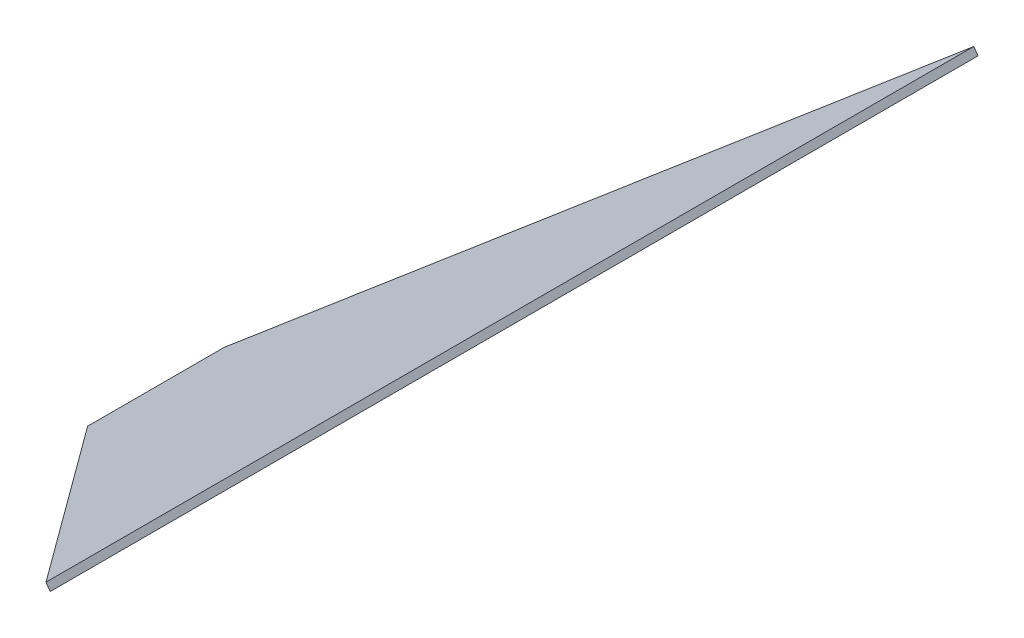
ISO-10303-21;
HEADER;
FILE_DESCRIPTION(('STEP AP214'),'2;1');
FILE_NAME('part.step','',(''),(''),'','','');
FILE_SCHEMA(('AUTOMOTIVE_DESIGN { 1 0 10303 214 1 1 1 1 }'));
ENDSEC;
DATA;
#1=APPLICATION_CONTEXT('core data for automotive mechanical design processes');
#2=APPLICATION_PROTOCOL_DEFINITION('international standard','automotive_design',2000,#1);
#3=PRODUCT_CONTEXT('',#1,'mechanical');
#4=PRODUCT('Part','Part','',(#3));
#5=PRODUCT_RELATED_PRODUCT_CATEGORY('part','',(#4));
#6=PRODUCT_DEFINITION_FORMATION('','',#4);
#7=PRODUCT_DEFINITION_CONTEXT('part definition',#1,'design');
#8=PRODUCT_DEFINITION('design','',#6,#7);
#9=PRODUCT_DEFINITION_SHAPE('','',#8);
#10=(LENGTH_UNIT() NAMED_UNIT(*) SI_UNIT(.MILLI.,.METRE.));
#11=(NAMED_UNIT(*) PLANE_ANGLE_UNIT() SI_UNIT($,.RADIAN.));
#12=(NAMED_UNIT(*) SI_UNIT($,.STERADIAN.) SOLID_ANGLE_UNIT());
#13=UNCERTAINTY_MEASURE_WITH_UNIT(LENGTH_MEASURE(1.E-05),#10,'distance_accuracy_value','');
#14=(GEOMETRIC_REPRESENTATION_CONTEXT(3) GLOBAL_UNCERTAINTY_ASSIGNED_CONTEXT((#13)) GLOBAL_UNIT_ASSIGNED_CONTEXT((#10,
#11,#12)) REPRESENTATION_CONTEXT('',''));
#15=CARTESIAN_POINT('',(0.,0.,0.));
#16=DIRECTION('',(0.,0.,1.));
#17=DIRECTION('',(1.,0.,0.));
#18=AXIS2_PLACEMENT_3D('',#15,#16,#17);
#19=CARTESIAN_POINT('',(50.0000000000007,38.099999999999,787.4));
#20=DIRECTION('',(0.827951759875369,0.560799325355586,0.));
#21=DIRECTION('',(-0.560799325355586,0.827951759875369,0.));
#22=AXIS2_PLACEMENT_3D('',#19,#20,#21);
#23=PLANE('',#22);
#24=DIRECTION('',(-0.560799325355585,0.827951759875369,0.));
#25=VECTOR('',#24,1.);
#26=CARTESIAN_POINT('',(144.348764995784,-101.194436509524,335.417163822782));
#27=LINE('',#26,#25);
#28=CARTESIAN_POINT('',(50.0000000000007,38.099999999999,335.417163822782));
#29=VERTEX_POINT('',#28);
#30=CARTESIAN_POINT('',(46.4950042165282,43.2746984992201,335.417163822782));
#31=VERTEX_POINT('',#30);
#32=EDGE_CURVE('E103',#29,#31,#27,.T.);
#33=ORIENTED_EDGE('',*,*,#32,.F.);
#34=DIRECTION('',(0.,0.,-1.));
#35=VECTOR('',#34,1.);
#36=CARTESIAN_POINT('',(50.0000000000007,38.099999999999,787.4));
#37=LINE('',#36,#35);
#38=CARTESIAN_POINT('',(50.0000000000007,38.099999999999,451.856561062794));
#39=VERTEX_POINT('',#38);
#40=EDGE_CURVE('E114',#39,#29,#37,.T.);
#41=ORIENTED_EDGE('',*,*,#40,.F.);
#42=DIRECTION('',(-0.560799325355585,0.827951759875369,0.));
#43=VECTOR('',#42,1.);
#44=CARTESIAN_POINT('',(144.348764995784,-101.194436509524,451.856561062794));
#45=LINE('',#44,#43);
#46=CARTESIAN_POINT('',(46.4950042165282,43.2746984992201,451.856561062794));
#47=VERTEX_POINT('',#46);
#48=EDGE_CURVE('E127',#39,#47,#45,.T.);
#49=ORIENTED_EDGE('',*,*,#48,.T.);
#50=DIRECTION('',(0.,0.,-1.));
#51=VECTOR('',#50,1.);
#52=CARTESIAN_POINT('',(46.4950042165283,43.27469849922,787.4));
#53=LINE('',#52,#51);
#54=EDGE_CURVE('E111',#47,#31,#53,.T.);
#55=ORIENTED_EDGE('',*,*,#54,.T.);
#56=EDGE_LOOP('',(#33,#41,#49,#55));
#57=FACE_BOUND('',#56,.T.);
#58=ADVANCED_FACE('F34',(#57),#23,.F.);
#59=CARTESIAN_POINT('',(50.0000000000007,38.099999999999,787.4));
#60=DIRECTION('',(-0.560799325355586,0.827951759875369,0.));
#61=DIRECTION('',(-0.827951759875369,-0.560799325355586,0.));
#62=AXIS2_PLACEMENT_3D('',#59,#60,#61);
#63=PLANE('',#62);
#64=DIRECTION('',(-0.607713287612984,-0.411624466809863,0.67915378109977));
#65=VECTOR('',#64,1.);
#66=CARTESIAN_POINT('',(-136.36188570095,-88.1291172481119,544.136114962536));
#67=LINE('',#66,#65);
#68=CARTESIAN_POINT('',(350.,241.3,0.599351180317731));
#69=VERTEX_POINT('',#68);
#70=CARTESIAN_POINT('',(50.2888323648038,38.2956357884256,335.543438937206));
#71=VERTEX_POINT('',#70);
#72=EDGE_CURVE('E121',#69,#71,#67,.T.);
#73=ORIENTED_EDGE('',*,*,#72,.F.);
#74=DIRECTION('',(0.,0.,-1.));
#75=VECTOR('',#74,1.);
#76=CARTESIAN_POINT('',(350.,241.299999999999,787.4));
#77=LINE('',#76,#75);
#78=CARTESIAN_POINT('',(350.,241.299999999999,786.800648819682));
#79=VERTEX_POINT('',#78);
#80=EDGE_CURVE('E42',#79,#69,#77,.T.);
#81=ORIENTED_EDGE('',*,*,#80,.F.);
#82=DIRECTION('',(-0.607713287612984,-0.411624466809863,-0.67915378109977));
#83=VECTOR('',#82,1.);
#84=CARTESIAN_POINT('',(188.622328193047,131.993523629423,606.45202352754));
#85=LINE('',#84,#83);
#86=CARTESIAN_POINT('',(50.2888323648038,38.2956357884257,451.856561062794));
#87=VERTEX_POINT('',#86);
#88=EDGE_CURVE('E49',#79,#87,#85,.T.);
#89=ORIENTED_EDGE('',*,*,#88,.T.);
#90=CARTESIAN_POINT('',(50.1444161823514,38.1978178941779,619.628280590382));
#91=DIRECTION('',(-0.560799325355586,0.827951759875369,0.));
#92=DIRECTION('',(-0.827951759875369,-0.560799325355586,0.));
#93=AXIS2_PLACEMENT_3D('',#90,#91,#92);
#94=CIRCLE('',#93,167.771810199502);
#95=EDGE_CURVE('E12',#87,#39,#94,.T.);
#96=ORIENTED_EDGE('',*,*,#95,.T.);
#97=ORIENTED_EDGE('',*,*,#40,.T.);
#98=DIRECTION('',(-0.778518517645294,-0.527316542618415,-0.340361839171689));
#99=VECTOR('',#98,1.);
#100=CARTESIAN_POINT('',(169.765505476388,119.221169042672,387.777649526531));
#101=LINE('',#100,#99);
#102=EDGE_CURVE('E123',#71,#29,#101,.T.);
#103=ORIENTED_EDGE('',*,*,#102,.F.);
#104=EDGE_LOOP('',(#73,#81,#89,#96,#97,#103));
#105=FACE_BOUND('',#104,.T.);
#106=ADVANCED_FACE('F36',(#105),#63,.F.);
#107=CARTESIAN_POINT('',(346.495004216528,246.47469849922,787.4));
#108=DIRECTION('',(-0.82795175987537,-0.560799325355583,0.));
#109=DIRECTION('',(0.560799325355583,-0.82795175987537,0.));
#110=AXIS2_PLACEMENT_3D('',#107,#108,#109);
#111=PLANE('',#110);
#112=DIRECTION('',(-0.560799325355585,0.827951759875369,0.));
#113=VECTOR('',#112,1.);
#114=CARTESIAN_POINT('',(444.348764995784,102.005563490477,0.599351180317731));
#115=LINE('',#114,#113);
#116=CARTESIAN_POINT('',(346.495004216528,246.474698499221,0.599351180317731));
#117=VERTEX_POINT('',#116);
#118=EDGE_CURVE('E91',#69,#117,#115,.T.);
#119=ORIENTED_EDGE('',*,*,#118,.T.);
#120=DIRECTION('',(0.,0.,-1.));
#121=VECTOR('',#120,1.);
#122=CARTESIAN_POINT('',(346.495004216528,246.47469849922,787.4));
#123=LINE('',#122,#121);
#124=CARTESIAN_POINT('',(346.495004216527,246.47469849922,786.800648819682));
#125=VERTEX_POINT('',#124);
#126=EDGE_CURVE('E101',#125,#117,#123,.T.);
#127=ORIENTED_EDGE('',*,*,#126,.F.);
#128=DIRECTION('',(-0.560799325355585,0.827951759875369,0.));
#129=VECTOR('',#128,1.);
#130=CARTESIAN_POINT('',(444.348764995784,102.005563490477,786.800648819682));
#131=LINE('',#130,#129);
#132=EDGE_CURVE('E104',#79,#125,#131,.T.);
#133=ORIENTED_EDGE('',*,*,#132,.F.);
#134=ORIENTED_EDGE('',*,*,#80,.T.);
#135=EDGE_LOOP('',(#119,#127,#133,#134));
#136=FACE_BOUND('',#135,.T.);
#137=ADVANCED_FACE('F100',(#136),#111,.F.);
#138=CARTESIAN_POINT('',(46.4950042165283,43.27469849922,787.4));
#139=DIRECTION('',(0.560799325355585,-0.827951759875369,0.));
#140=DIRECTION('',(0.827951759875369,0.560799325355585,0.));
#141=AXIS2_PLACEMENT_3D('',#138,#139,#140);
#142=PLANE('',#141);
#143=CARTESIAN_POINT('',(46.639420398879,43.3725163933991,619.628280590382));
#144=DIRECTION('',(-0.560799325355586,0.827951759875369,0.));
#145=DIRECTION('',(-0.827951759875369,-0.560799325355586,0.));
#146=AXIS2_PLACEMENT_3D('',#143,#144,#145);
#147=CIRCLE('',#146,167.771810199502);
#148=CARTESIAN_POINT('',(46.7838365813314,43.4703342876468,451.856561062794));
#149=VERTEX_POINT('',#148);
#150=EDGE_CURVE('E128',#149,#47,#147,.T.);
#151=ORIENTED_EDGE('',*,*,#150,.F.);
#152=DIRECTION('',(-0.607713287612984,-0.411624466809863,-0.67915378109977));
#153=VECTOR('',#152,1.);
#154=CARTESIAN_POINT('',(-167.863355450794,-101.917363782114,211.976250655785));
#155=LINE('',#154,#153);
#156=EDGE_CURVE('E110',#125,#149,#155,.T.);
#157=ORIENTED_EDGE('',*,*,#156,.F.);
#158=ORIENTED_EDGE('',*,*,#126,.T.);
#159=DIRECTION('',(-0.607713287612984,-0.411624466809863,0.67915378109977));
#160=VECTOR('',#159,1.);
#161=CARTESIAN_POINT('',(46.7838365813314,43.4703342876466,335.543438937206));
#162=LINE('',#161,#160);
#163=CARTESIAN_POINT('',(46.7838365813314,43.4703342876466,335.543438937206));
#164=VERTEX_POINT('',#163);
#165=EDGE_CURVE('E88',#117,#164,#162,.T.);
#166=ORIENTED_EDGE('',*,*,#165,.T.);
#167=DIRECTION('',(0.778518517645294,0.527316542618415,0.340361839171689));
#168=VECTOR('',#167,1.);
#169=CARTESIAN_POINT('',(166.260509692916,124.395867541893,387.777649526531));
#170=LINE('',#169,#168);
#171=EDGE_CURVE('E57',#31,#164,#170,.T.);
#172=ORIENTED_EDGE('',*,*,#171,.F.);
#173=ORIENTED_EDGE('',*,*,#54,.F.);
#174=EDGE_LOOP('',(#151,#157,#158,#166,#172,#173));
#175=FACE_BOUND('',#174,.T.);
#176=ADVANCED_FACE('F108',(#175),#142,.F.);
#177=CARTESIAN_POINT('',(254.974619222459,-26.2638579133227,212.235610854139));
#178=DIRECTION('',(-0.562306568287565,-0.380868982253446,-0.73399600926564));
#179=DIRECTION('',(-0.793827574173148,0.,0.608142896433376));
#180=AXIS2_PLACEMENT_3D('',#177,#178,#179);
#181=PLANE('',#180);
#182=ORIENTED_EDGE('',*,*,#72,.T.);
#183=DIRECTION('',(-0.560799325355585,0.827951759875369,0.));
#184=VECTOR('',#183,1.);
#185=CARTESIAN_POINT('',(144.637597360588,-100.998800721097,335.543438937206));
#186=LINE('',#185,#184);
#187=EDGE_CURVE('E93',#71,#164,#186,.T.);
#188=ORIENTED_EDGE('',*,*,#187,.T.);
#189=ORIENTED_EDGE('',*,*,#165,.F.);
#190=ORIENTED_EDGE('',*,*,#118,.F.);
#191=EDGE_LOOP('',(#182,#188,#189,#190));
#192=FACE_BOUND('',#191,.T.);
#193=ADVANCED_FACE('F90',(#192),#181,.T.);
#194=CARTESIAN_POINT('',(9.52501458430563,-192.515056788232,276.473338320891));
#195=DIRECTION('',(0.281803183736617,0.19087468978427,-0.940294538129232));
#196=DIRECTION('',(-0.95790620751376,0.,-0.287081343187964));
#197=AXIS2_PLACEMENT_3D('',#194,#195,#196);
#198=PLANE('',#197);
#199=ORIENTED_EDGE('',*,*,#102,.T.);
#200=ORIENTED_EDGE('',*,*,#32,.T.);
#201=ORIENTED_EDGE('',*,*,#171,.T.);
#202=ORIENTED_EDGE('',*,*,#187,.F.);
#203=EDGE_LOOP('',(#199,#200,#201,#202));
#204=FACE_BOUND('',#203,.T.);
#205=ADVANCED_FACE('F136',(#204),#198,.T.);
#206=CARTESIAN_POINT('',(144.493181178135,-101.096618615345,619.628280590382));
#207=DIRECTION('',(-0.560799325355585,0.827951759875369,0.));
#208=DIRECTION('',(-0.827951759875369,-0.560799325355585,0.));
#209=AXIS2_PLACEMENT_3D('',#206,#207,#208);
#210=CYLINDRICAL_SURFACE('',#209,167.771810199502);
#211=DIRECTION('',(-0.560799325355585,0.827951759875369,0.));
#212=VECTOR('',#211,1.);
#213=CARTESIAN_POINT('',(144.637597360588,-100.998800721097,451.856561062794));
#214=LINE('',#213,#212);
#215=EDGE_CURVE('E125',#87,#149,#214,.T.);
#216=ORIENTED_EDGE('',*,*,#215,.T.);
#217=ORIENTED_EDGE('',*,*,#150,.T.);
#218=ORIENTED_EDGE('',*,*,#48,.F.);
#219=ORIENTED_EDGE('',*,*,#95,.F.);
#220=EDGE_LOOP('',(#216,#217,#218,#219));
#221=FACE_BOUND('',#220,.T.);
#222=ADVANCED_FACE('F142',(#221),#210,.F.);
#223=CARTESIAN_POINT('',(-70.0095946715384,-246.386498790858,211.976250655785));
#224=DIRECTION('',(0.562306568287565,0.380868982253446,-0.73399600926564));
#225=DIRECTION('',(-0.793827574173148,0.,-0.608142896433376));
#226=AXIS2_PLACEMENT_3D('',#223,#224,#225);
#227=PLANE('',#226);
#228=ORIENTED_EDGE('',*,*,#132,.T.);
#229=ORIENTED_EDGE('',*,*,#156,.T.);
#230=ORIENTED_EDGE('',*,*,#215,.F.);
#231=ORIENTED_EDGE('',*,*,#88,.F.);
#232=EDGE_LOOP('',(#228,#229,#230,#231));
#233=FACE_BOUND('',#232,.T.);
#234=ADVANCED_FACE('F143',(#233),#227,.F.);
#235=CLOSED_SHELL('',(#58,#106,#137,#176,#193,#205,#222,#234));
#236=MANIFOLD_SOLID_BREP('B2',#235);
#237=ADVANCED_BREP_SHAPE_REPRESENTATION('',(#18,#236),#14);
#238=SHAPE_DEFINITION_REPRESENTATION(#9,#237);
ENDSEC;
END-ISO-10303-21;
